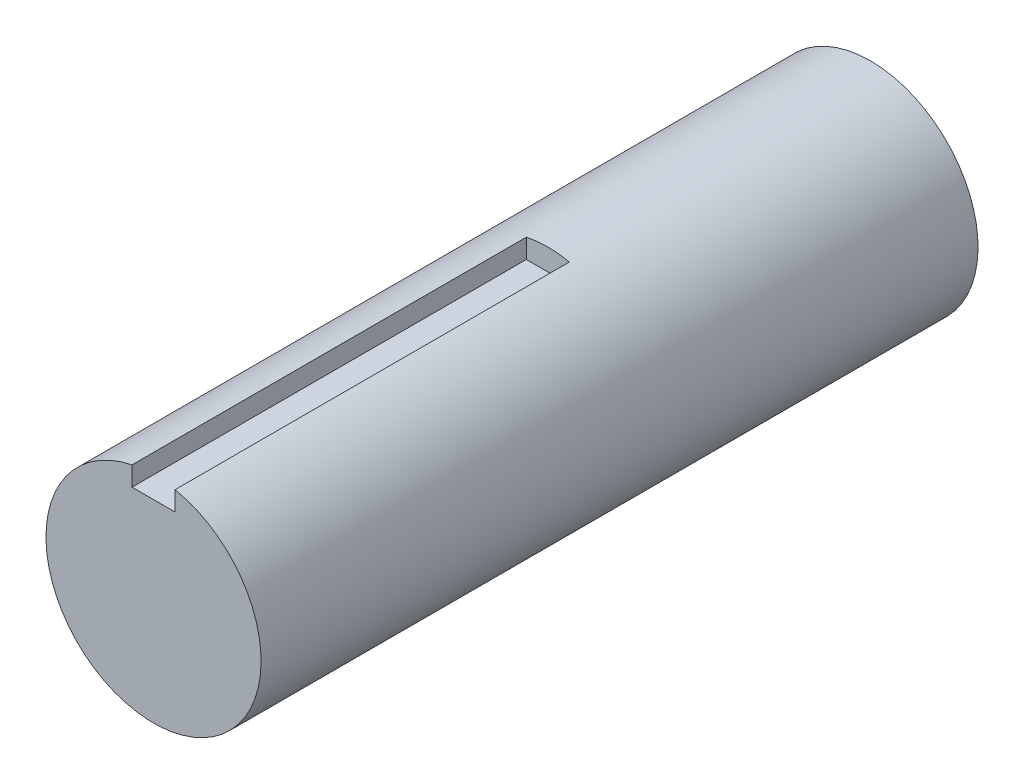
ISO-10303-21;
HEADER;
FILE_DESCRIPTION(('STEP AP214'),'2;1');
FILE_NAME('part.step','',(''),(''),'','','');
FILE_SCHEMA(('AUTOMOTIVE_DESIGN { 1 0 10303 214 1 1 1 1 }'));
ENDSEC;
DATA;
#1=APPLICATION_CONTEXT('core data for automotive mechanical design processes');
#2=APPLICATION_PROTOCOL_DEFINITION('international standard','automotive_design',2000,#1);
#3=PRODUCT_CONTEXT('',#1,'mechanical');
#4=PRODUCT('Part','Part','',(#3));
#5=PRODUCT_RELATED_PRODUCT_CATEGORY('part','',(#4));
#6=PRODUCT_DEFINITION_FORMATION('','',#4);
#7=PRODUCT_DEFINITION_CONTEXT('part definition',#1,'design');
#8=PRODUCT_DEFINITION('design','',#6,#7);
#9=PRODUCT_DEFINITION_SHAPE('','',#8);
#10=(LENGTH_UNIT() NAMED_UNIT(*) SI_UNIT(.MILLI.,.METRE.));
#11=(NAMED_UNIT(*) PLANE_ANGLE_UNIT() SI_UNIT($,.RADIAN.));
#12=(NAMED_UNIT(*) SI_UNIT($,.STERADIAN.) SOLID_ANGLE_UNIT());
#13=UNCERTAINTY_MEASURE_WITH_UNIT(LENGTH_MEASURE(1.E-05),#10,'distance_accuracy_value','');
#14=(GEOMETRIC_REPRESENTATION_CONTEXT(3) GLOBAL_UNCERTAINTY_ASSIGNED_CONTEXT((#13)) GLOBAL_UNIT_ASSIGNED_CONTEXT((#10,
#11,#12)) REPRESENTATION_CONTEXT('',''));
#15=CARTESIAN_POINT('',(0.,0.,0.));
#16=DIRECTION('',(0.,0.,1.));
#17=DIRECTION('',(1.,0.,0.));
#18=AXIS2_PLACEMENT_3D('',#15,#16,#17);
#19=CARTESIAN_POINT('',(0.,-7.50000000000001,50.));
#20=DIRECTION('',(0.,0.,1.));
#21=DIRECTION('',(0.,-1.,0.));
#22=AXIS2_PLACEMENT_3D('',#19,#20,#21);
#23=PLANE('',#22);
#24=DIRECTION('',(0.,1.,0.));
#25=VECTOR('',#24,1.);
#26=CARTESIAN_POINT('',(3.,4.49999999999999,50.));
#27=LINE('',#26,#25);
#28=CARTESIAN_POINT('',(3.,4.49999999999999,50.));
#29=VERTEX_POINT('',#28);
#30=CARTESIAN_POINT('',(3.,7.19693845669906,50.));
#31=VERTEX_POINT('',#30);
#32=EDGE_CURVE('E101',#29,#31,#27,.T.);
#33=ORIENTED_EDGE('',*,*,#32,.F.);
#34=DIRECTION('',(1.,0.,0.));
#35=VECTOR('',#34,1.);
#36=CARTESIAN_POINT('',(-3.,4.49999999999999,50.));
#37=LINE('',#36,#35);
#38=CARTESIAN_POINT('',(-3.,4.49999999999999,50.));
#39=VERTEX_POINT('',#38);
#40=EDGE_CURVE('E106',#39,#29,#37,.T.);
#41=ORIENTED_EDGE('',*,*,#40,.F.);
#42=DIRECTION('',(0.,-1.,0.));
#43=VECTOR('',#42,1.);
#44=CARTESIAN_POINT('',(-3.,4.49999999999999,50.));
#45=LINE('',#44,#43);
#46=CARTESIAN_POINT('',(-3.,7.19693845669906,50.));
#47=VERTEX_POINT('',#46);
#48=EDGE_CURVE('E89',#47,#39,#45,.T.);
#49=ORIENTED_EDGE('',*,*,#48,.F.);
#50=CARTESIAN_POINT('',(0.,-7.50000000000001,50.));
#51=DIRECTION('',(0.,0.,-1.));
#52=DIRECTION('',(0.,1.,0.));
#53=AXIS2_PLACEMENT_3D('',#50,#51,#52);
#54=CIRCLE('',#53,15.);
#55=EDGE_CURVE('E110',#31,#47,#54,.T.);
#56=ORIENTED_EDGE('',*,*,#55,.F.);
#57=EDGE_LOOP('',(#33,#41,#49,#56));
#58=FACE_BOUND('',#57,.T.);
#59=ADVANCED_FACE('F39',(#58),#23,.T.);
#60=CARTESIAN_POINT('',(0.,-7.49999999999999,-50.));
#61=DIRECTION('',(0.,0.,-1.));
#62=DIRECTION('',(0.,1.,0.));
#63=AXIS2_PLACEMENT_3D('',#60,#61,#62);
#64=PLANE('',#63);
#65=CARTESIAN_POINT('',(0.,-7.49999999999999,-50.));
#66=DIRECTION('',(0.,0.,-1.));
#67=DIRECTION('',(0.,1.,0.));
#68=AXIS2_PLACEMENT_3D('',#65,#66,#67);
#69=CIRCLE('',#68,15.);
#70=CARTESIAN_POINT('',(0.,7.50000000000001,-50.));
#71=VERTEX_POINT('',#70);
#72=EDGE_CURVE('E115',#71,#71,#69,.T.);
#73=ORIENTED_EDGE('',*,*,#72,.T.);
#74=EDGE_LOOP('',(#73));
#75=FACE_BOUND('',#74,.T.);
#76=ADVANCED_FACE('F138',(#75),#64,.T.);
#77=CARTESIAN_POINT('',(0.,-7.49999999999999,-50.));
#78=DIRECTION('',(0.,0.,-1.));
#79=DIRECTION('',(0.,1.,0.));
#80=AXIS2_PLACEMENT_3D('',#77,#78,#79);
#81=CYLINDRICAL_SURFACE('',#80,15.);
#82=DIRECTION('',(0.,0.,-1.));
#83=VECTOR('',#82,1.);
#84=CARTESIAN_POINT('',(3.,7.19693845669907,-50.));
#85=LINE('',#84,#83);
#86=CARTESIAN_POINT('',(3.,7.19693845669907,-5.00000000000004));
#87=VERTEX_POINT('',#86);
#88=EDGE_CURVE('E11',#31,#87,#85,.T.);
#89=ORIENTED_EDGE('',*,*,#88,.F.);
#90=ORIENTED_EDGE('',*,*,#55,.T.);
#91=DIRECTION('',(0.,0.,-1.));
#92=VECTOR('',#91,1.);
#93=CARTESIAN_POINT('',(-3.,7.19693845669907,-50.));
#94=LINE('',#93,#92);
#95=CARTESIAN_POINT('',(-3.,7.19693845669907,-5.00000000000004));
#96=VERTEX_POINT('',#95);
#97=EDGE_CURVE('E47',#96,#47,#94,.F.);
#98=ORIENTED_EDGE('',*,*,#97,.F.);
#99=CARTESIAN_POINT('',(0.,-7.5,-5.00000000000004));
#100=DIRECTION('',(0.,0.,-1.));
#101=DIRECTION('',(-1.,0.,0.));
#102=AXIS2_PLACEMENT_3D('',#99,#100,#101);
#103=CIRCLE('',#102,15.);
#104=EDGE_CURVE('E58',#87,#96,#103,.F.);
#105=ORIENTED_EDGE('',*,*,#104,.F.);
#106=EDGE_LOOP('',(#89,#90,#98,#105));
#107=FACE_BOUND('',#106,.T.);
#108=ORIENTED_EDGE('',*,*,#72,.F.);
#109=EDGE_LOOP('',(#108));
#110=FACE_BOUND('',#109,.T.);
#111=ADVANCED_FACE('F126',(#107,#110),#81,.T.);
#112=CARTESIAN_POINT('',(3.,4.49999999999999,-5.00000000000004));
#113=DIRECTION('',(1.,0.,0.));
#114=DIRECTION('',(0.,0.,-1.));
#115=AXIS2_PLACEMENT_3D('',#112,#113,#114);
#116=PLANE('',#115);
#117=ORIENTED_EDGE('',*,*,#88,.T.);
#118=DIRECTION('',(0.,1.,0.));
#119=VECTOR('',#118,1.);
#120=CARTESIAN_POINT('',(3.,4.49999999999999,-5.00000000000004));
#121=LINE('',#120,#119);
#122=CARTESIAN_POINT('',(3.,4.49999999999999,-5.00000000000004));
#123=VERTEX_POINT('',#122);
#124=EDGE_CURVE('E54',#123,#87,#121,.T.);
#125=ORIENTED_EDGE('',*,*,#124,.F.);
#126=DIRECTION('',(0.,0.,1.));
#127=VECTOR('',#126,1.);
#128=CARTESIAN_POINT('',(3.,4.49999999999999,-5.00000000000004));
#129=LINE('',#128,#127);
#130=EDGE_CURVE('E94',#123,#29,#129,.T.);
#131=ORIENTED_EDGE('',*,*,#130,.T.);
#132=ORIENTED_EDGE('',*,*,#32,.T.);
#133=EDGE_LOOP('',(#117,#125,#131,#132));
#134=FACE_BOUND('',#133,.T.);
#135=ADVANCED_FACE('F129',(#134),#116,.F.);
#136=CARTESIAN_POINT('',(-3.,4.49999999999999,-5.00000000000004));
#137=DIRECTION('',(0.,-1.,0.));
#138=DIRECTION('',(0.,0.,-1.));
#139=AXIS2_PLACEMENT_3D('',#136,#137,#138);
#140=PLANE('',#139);
#141=ORIENTED_EDGE('',*,*,#40,.T.);
#142=ORIENTED_EDGE('',*,*,#130,.F.);
#143=DIRECTION('',(1.,0.,0.));
#144=VECTOR('',#143,1.);
#145=CARTESIAN_POINT('',(-3.,4.49999999999999,-5.00000000000004));
#146=LINE('',#145,#144);
#147=CARTESIAN_POINT('',(-3.,4.49999999999999,-5.00000000000004));
#148=VERTEX_POINT('',#147);
#149=EDGE_CURVE('E80',#148,#123,#146,.T.);
#150=ORIENTED_EDGE('',*,*,#149,.F.);
#151=DIRECTION('',(0.,0.,1.));
#152=VECTOR('',#151,1.);
#153=CARTESIAN_POINT('',(-3.,4.49999999999999,-5.00000000000004));
#154=LINE('',#153,#152);
#155=EDGE_CURVE('E86',#148,#39,#154,.T.);
#156=ORIENTED_EDGE('',*,*,#155,.T.);
#157=EDGE_LOOP('',(#141,#142,#150,#156));
#158=FACE_BOUND('',#157,.T.);
#159=ADVANCED_FACE('F96',(#158),#140,.F.);
#160=CARTESIAN_POINT('',(-3.,4.49999999999999,-5.00000000000004));
#161=DIRECTION('',(-1.,0.,0.));
#162=DIRECTION('',(0.,0.,1.));
#163=AXIS2_PLACEMENT_3D('',#160,#161,#162);
#164=PLANE('',#163);
#165=ORIENTED_EDGE('',*,*,#97,.T.);
#166=ORIENTED_EDGE('',*,*,#48,.T.);
#167=ORIENTED_EDGE('',*,*,#155,.F.);
#168=DIRECTION('',(0.,-1.,0.));
#169=VECTOR('',#168,1.);
#170=CARTESIAN_POINT('',(-3.,4.49999999999999,-5.00000000000004));
#171=LINE('',#170,#169);
#172=EDGE_CURVE('E76',#96,#148,#171,.T.);
#173=ORIENTED_EDGE('',*,*,#172,.F.);
#174=EDGE_LOOP('',(#165,#166,#167,#173));
#175=FACE_BOUND('',#174,.T.);
#176=ADVANCED_FACE('F87',(#175),#164,.F.);
#177=CARTESIAN_POINT('',(0.,0.,-5.00000000000004));
#178=DIRECTION('',(0.,0.,-1.));
#179=DIRECTION('',(-1.,0.,0.));
#180=AXIS2_PLACEMENT_3D('',#177,#178,#179);
#181=PLANE('',#180);
#182=ORIENTED_EDGE('',*,*,#104,.T.);
#183=ORIENTED_EDGE('',*,*,#172,.T.);
#184=ORIENTED_EDGE('',*,*,#149,.T.);
#185=ORIENTED_EDGE('',*,*,#124,.T.);
#186=EDGE_LOOP('',(#182,#183,#184,#185));
#187=FACE_BOUND('',#186,.T.);
#188=ADVANCED_FACE('F78',(#187),#181,.F.);
#189=CLOSED_SHELL('',(#59,#76,#111,#135,#159,#176,#188));
#190=MANIFOLD_SOLID_BREP('B2',#189);
#191=ADVANCED_BREP_SHAPE_REPRESENTATION('',(#18,#190),#14);
#192=SHAPE_DEFINITION_REPRESENTATION(#9,#191);
ENDSEC;
END-ISO-10303-21;
